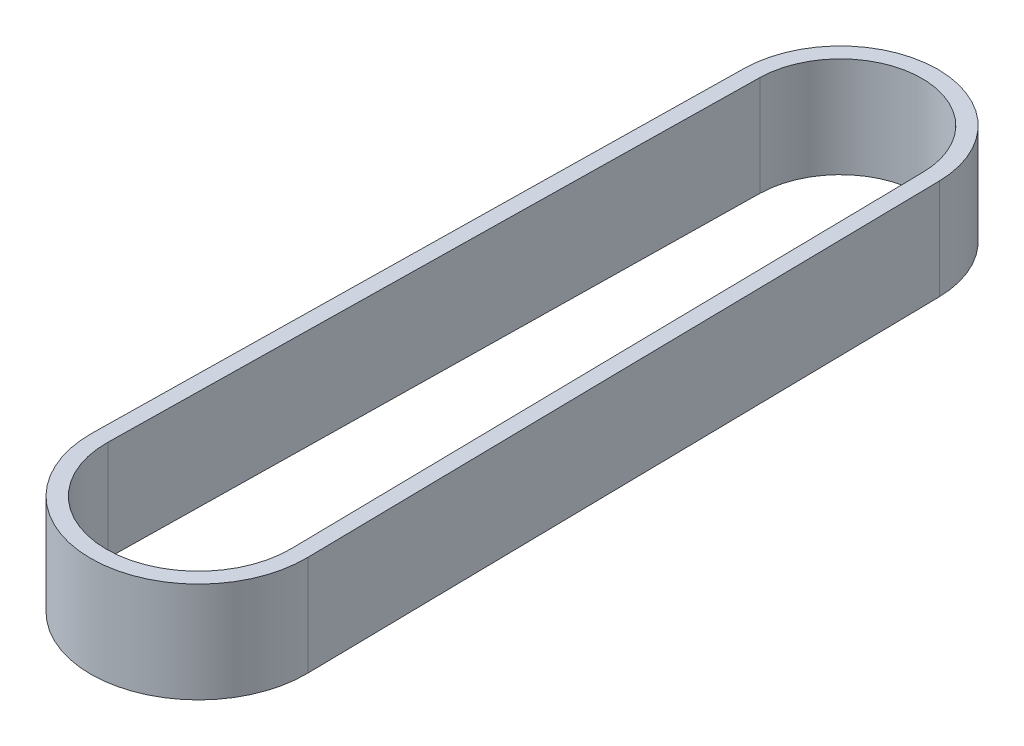
ISO-10303-21;
HEADER;
FILE_DESCRIPTION(('STEP AP214'),'2;1');
FILE_NAME('part.step','',(''),(''),'','','');
FILE_SCHEMA(('AUTOMOTIVE_DESIGN { 1 0 10303 214 1 1 1 1 }'));
ENDSEC;
DATA;
#1=APPLICATION_CONTEXT('core data for automotive mechanical design processes');
#2=APPLICATION_PROTOCOL_DEFINITION('international standard','automotive_design',2000,#1);
#3=PRODUCT_CONTEXT('',#1,'mechanical');
#4=PRODUCT('Part','Part','',(#3));
#5=PRODUCT_RELATED_PRODUCT_CATEGORY('part','',(#4));
#6=PRODUCT_DEFINITION_FORMATION('','',#4);
#7=PRODUCT_DEFINITION_CONTEXT('part definition',#1,'design');
#8=PRODUCT_DEFINITION('design','',#6,#7);
#9=PRODUCT_DEFINITION_SHAPE('','',#8);
#10=(LENGTH_UNIT() NAMED_UNIT(*) SI_UNIT(.MILLI.,.METRE.));
#11=(NAMED_UNIT(*) PLANE_ANGLE_UNIT() SI_UNIT($,.RADIAN.));
#12=(NAMED_UNIT(*) SI_UNIT($,.STERADIAN.) SOLID_ANGLE_UNIT());
#13=UNCERTAINTY_MEASURE_WITH_UNIT(LENGTH_MEASURE(1.E-05),#10,'distance_accuracy_value','');
#14=(GEOMETRIC_REPRESENTATION_CONTEXT(3) GLOBAL_UNCERTAINTY_ASSIGNED_CONTEXT((#13)) GLOBAL_UNIT_ASSIGNED_CONTEXT((#10,
#11,#12)) REPRESENTATION_CONTEXT('',''));
#15=CARTESIAN_POINT('',(0.,0.,0.));
#16=DIRECTION('',(0.,0.,1.));
#17=DIRECTION('',(1.,0.,0.));
#18=AXIS2_PLACEMENT_3D('',#15,#16,#17);
#19=CARTESIAN_POINT('',(1.04950770296597E-13,3.175,12.1000000000001));
#20=DIRECTION('',(0.,1.,0.));
#21=DIRECTION('',(0.,0.,1.));
#22=AXIS2_PLACEMENT_3D('',#19,#20,#21);
#23=PLANE('',#22);
#24=CARTESIAN_POINT('',(1.04950770296597E-13,3.175,12.1000000000001));
#25=DIRECTION('',(0.,1.,0.));
#26=DIRECTION('',(0.,0.,1.));
#27=AXIS2_PLACEMENT_3D('',#24,#25,#26);
#28=CIRCLE('',#27,6.82);
#29=CARTESIAN_POINT('',(-6.8191407924458,3.175,11.9917463497139));
#30=VERTEX_POINT('',#29);
#31=CARTESIAN_POINT('',(6.81914079244601,3.175,11.9917463497139));
#32=VERTEX_POINT('',#31);
#33=EDGE_CURVE('E134',#30,#32,#28,.T.);
#34=ORIENTED_EDGE('',*,*,#33,.T.);
#35=DIRECTION('',(-0.015872969250171,0.,-0.999874016487669));
#36=VECTOR('',#35,1.);
#37=CARTESIAN_POINT('',(6.81914079244601,3.175,11.9917463497139));
#38=LINE('',#37,#36);
#39=CARTESIAN_POINT('',(6.17422205181156,3.175,-28.6331349401801));
#40=VERTEX_POINT('',#39);
#41=EDGE_CURVE('E137',#32,#40,#38,.T.);
#42=ORIENTED_EDGE('',*,*,#41,.T.);
#43=CARTESIAN_POINT('',(2.08166817117217E-13,3.175,-28.5351193550603));
#44=DIRECTION('',(0.,1.,0.));
#45=DIRECTION('',(0.,0.,1.));
#46=AXIS2_PLACEMENT_3D('',#43,#44,#45);
#47=CIRCLE('',#46,6.175);
#48=CARTESIAN_POINT('',(-6.17422205181115,3.175,-28.6331349401801));
#49=VERTEX_POINT('',#48);
#50=EDGE_CURVE('E140',#40,#49,#47,.T.);
#51=ORIENTED_EDGE('',*,*,#50,.T.);
#52=DIRECTION('',(-0.0158729692501762,0.,0.999874016487669));
#53=VECTOR('',#52,1.);
#54=CARTESIAN_POINT('',(-6.17422205181115,3.175,-28.6331349401801));
#55=LINE('',#54,#53);
#56=EDGE_CURVE('E142',#49,#30,#55,.T.);
#57=ORIENTED_EDGE('',*,*,#56,.T.);
#58=EDGE_LOOP('',(#34,#42,#51,#57));
#59=FACE_BOUND('',#58,.T.);
#60=DIRECTION('',(-0.015872969250171,0.,-0.999874016487669));
#61=VECTOR('',#60,1.);
#62=CARTESIAN_POINT('',(5.81926677595834,3.175,12.0076193189641));
#63=LINE('',#62,#61);
#64=CARTESIAN_POINT('',(5.81926677595834,3.175,12.0076193189641));
#65=VERTEX_POINT('',#64);
#66=CARTESIAN_POINT('',(5.17434803532389,3.175,-28.6172619709299));
#67=VERTEX_POINT('',#66);
#68=EDGE_CURVE('E106',#65,#67,#63,.T.);
#69=ORIENTED_EDGE('',*,*,#68,.F.);
#70=CARTESIAN_POINT('',(1.04950770296597E-13,3.175,12.1000000000001));
#71=DIRECTION('',(0.,1.,0.));
#72=DIRECTION('',(0.,0.,1.));
#73=AXIS2_PLACEMENT_3D('',#70,#71,#72);
#74=CIRCLE('',#73,5.82);
#75=CARTESIAN_POINT('',(-5.81926677595814,3.175,12.0076193189641));
#76=VERTEX_POINT('',#75);
#77=EDGE_CURVE('E98',#76,#65,#74,.T.);
#78=ORIENTED_EDGE('',*,*,#77,.F.);
#79=DIRECTION('',(-0.0158729692501761,0.,0.999874016487669));
#80=VECTOR('',#79,1.);
#81=CARTESIAN_POINT('',(-5.17434803532348,3.175,-28.6172619709299));
#82=LINE('',#81,#80);
#83=CARTESIAN_POINT('',(-5.17434803532348,3.175,-28.6172619709299));
#84=VERTEX_POINT('',#83);
#85=EDGE_CURVE('E120',#84,#76,#82,.T.);
#86=ORIENTED_EDGE('',*,*,#85,.F.);
#87=CARTESIAN_POINT('',(2.08166817117217E-13,3.175,-28.5351193550603));
#88=DIRECTION('',(0.,1.,0.));
#89=DIRECTION('',(0.,0.,1.));
#90=AXIS2_PLACEMENT_3D('',#87,#88,#89);
#91=CIRCLE('',#90,5.175);
#92=EDGE_CURVE('E118',#67,#84,#91,.T.);
#93=ORIENTED_EDGE('',*,*,#92,.F.);
#94=EDGE_LOOP('',(#69,#78,#86,#93));
#95=FACE_BOUND('',#94,.T.);
#96=ADVANCED_FACE('F33',(#59,#95),#23,.T.);
#97=CARTESIAN_POINT('',(1.04950770296597E-13,-3.175,12.1000000000001));
#98=DIRECTION('',(0.,1.,0.));
#99=DIRECTION('',(0.,0.,1.));
#100=AXIS2_PLACEMENT_3D('',#97,#98,#99);
#101=PLANE('',#100);
#102=CARTESIAN_POINT('',(1.04950770296597E-13,-3.175,12.1000000000001));
#103=DIRECTION('',(0.,1.,0.));
#104=DIRECTION('',(0.,0.,1.));
#105=AXIS2_PLACEMENT_3D('',#102,#103,#104);
#106=CIRCLE('',#105,6.82);
#107=CARTESIAN_POINT('',(-6.8191407924458,-3.175,11.9917463497139));
#108=VERTEX_POINT('',#107);
#109=CARTESIAN_POINT('',(6.81914079244601,-3.175,11.9917463497139));
#110=VERTEX_POINT('',#109);
#111=EDGE_CURVE('E114',#108,#110,#106,.T.);
#112=ORIENTED_EDGE('',*,*,#111,.F.);
#113=DIRECTION('',(-0.0158729692501762,0.,0.999874016487669));
#114=VECTOR('',#113,1.);
#115=CARTESIAN_POINT('',(-6.17422205181115,-3.175,-28.6331349401801));
#116=LINE('',#115,#114);
#117=CARTESIAN_POINT('',(-6.17422205181115,-3.175,-28.6331349401801));
#118=VERTEX_POINT('',#117);
#119=EDGE_CURVE('E138',#118,#108,#116,.T.);
#120=ORIENTED_EDGE('',*,*,#119,.F.);
#121=CARTESIAN_POINT('',(2.08166817117217E-13,-3.175,-28.5351193550603));
#122=DIRECTION('',(0.,1.,0.));
#123=DIRECTION('',(0.,0.,1.));
#124=AXIS2_PLACEMENT_3D('',#121,#122,#123);
#125=CIRCLE('',#124,6.175);
#126=CARTESIAN_POINT('',(6.17422205181156,-3.175,-28.6331349401801));
#127=VERTEX_POINT('',#126);
#128=EDGE_CURVE('E149',#127,#118,#125,.T.);
#129=ORIENTED_EDGE('',*,*,#128,.F.);
#130=DIRECTION('',(-0.015872969250171,0.,-0.999874016487669));
#131=VECTOR('',#130,1.);
#132=CARTESIAN_POINT('',(6.81914079244601,-3.175,11.9917463497139));
#133=LINE('',#132,#131);
#134=EDGE_CURVE('E147',#110,#127,#133,.T.);
#135=ORIENTED_EDGE('',*,*,#134,.F.);
#136=EDGE_LOOP('',(#112,#120,#129,#135));
#137=FACE_BOUND('',#136,.T.);
#138=CARTESIAN_POINT('',(1.04950770296597E-13,-3.175,12.1000000000001));
#139=DIRECTION('',(0.,1.,0.));
#140=DIRECTION('',(0.,0.,1.));
#141=AXIS2_PLACEMENT_3D('',#138,#139,#140);
#142=CIRCLE('',#141,5.82);
#143=CARTESIAN_POINT('',(-5.81926677595814,-3.175,12.0076193189641));
#144=VERTEX_POINT('',#143);
#145=CARTESIAN_POINT('',(5.81926677595834,-3.175,12.0076193189641));
#146=VERTEX_POINT('',#145);
#147=EDGE_CURVE('E56',#144,#146,#142,.T.);
#148=ORIENTED_EDGE('',*,*,#147,.T.);
#149=DIRECTION('',(-0.015872969250171,0.,-0.999874016487669));
#150=VECTOR('',#149,1.);
#151=CARTESIAN_POINT('',(5.81926677595834,-3.175,12.0076193189641));
#152=LINE('',#151,#150);
#153=CARTESIAN_POINT('',(5.17434803532389,-3.175,-28.6172619709299));
#154=VERTEX_POINT('',#153);
#155=EDGE_CURVE('E113',#146,#154,#152,.T.);
#156=ORIENTED_EDGE('',*,*,#155,.T.);
#157=CARTESIAN_POINT('',(2.08166817117217E-13,-3.175,-28.5351193550603));
#158=DIRECTION('',(0.,1.,0.));
#159=DIRECTION('',(0.,0.,1.));
#160=AXIS2_PLACEMENT_3D('',#157,#158,#159);
#161=CIRCLE('',#160,5.175);
#162=CARTESIAN_POINT('',(-5.17434803532348,-3.175,-28.6172619709299));
#163=VERTEX_POINT('',#162);
#164=EDGE_CURVE('E126',#154,#163,#161,.T.);
#165=ORIENTED_EDGE('',*,*,#164,.T.);
#166=DIRECTION('',(-0.0158729692501761,0.,0.999874016487669));
#167=VECTOR('',#166,1.);
#168=CARTESIAN_POINT('',(-5.17434803532348,-3.175,-28.6172619709299));
#169=LINE('',#168,#167);
#170=EDGE_CURVE('E107',#163,#144,#169,.T.);
#171=ORIENTED_EDGE('',*,*,#170,.T.);
#172=EDGE_LOOP('',(#148,#156,#165,#171));
#173=FACE_BOUND('',#172,.T.);
#174=ADVANCED_FACE('F167',(#137,#173),#101,.F.);
#175=CARTESIAN_POINT('',(1.04950770296597E-13,3.175,12.1000000000001));
#176=DIRECTION('',(0.,-1.,0.));
#177=DIRECTION('',(0.,0.,-1.));
#178=AXIS2_PLACEMENT_3D('',#175,#176,#177);
#179=CYLINDRICAL_SURFACE('',#178,6.82);
#180=ORIENTED_EDGE('',*,*,#111,.T.);
#181=DIRECTION('',(0.,-1.,0.));
#182=VECTOR('',#181,1.);
#183=CARTESIAN_POINT('',(6.81914079244601,3.175,11.9917463497139));
#184=LINE('',#183,#182);
#185=EDGE_CURVE('E11',#32,#110,#184,.T.);
#186=ORIENTED_EDGE('',*,*,#185,.F.);
#187=ORIENTED_EDGE('',*,*,#33,.F.);
#188=DIRECTION('',(0.,-1.,0.));
#189=VECTOR('',#188,1.);
#190=CARTESIAN_POINT('',(-6.8191407924458,3.175,11.9917463497139));
#191=LINE('',#190,#189);
#192=EDGE_CURVE('E144',#30,#108,#191,.T.);
#193=ORIENTED_EDGE('',*,*,#192,.T.);
#194=EDGE_LOOP('',(#180,#186,#187,#193));
#195=FACE_BOUND('',#194,.T.);
#196=ADVANCED_FACE('F35',(#195),#179,.T.);
#197=CARTESIAN_POINT('',(6.81914079244601,3.175,11.9917463497139));
#198=DIRECTION('',(-0.999874016487669,0.,0.015872969250171));
#199=DIRECTION('',(0.015872969250171,0.,0.999874016487669));
#200=AXIS2_PLACEMENT_3D('',#197,#198,#199);
#201=PLANE('',#200);
#202=ORIENTED_EDGE('',*,*,#134,.T.);
#203=DIRECTION('',(0.,-1.,0.));
#204=VECTOR('',#203,1.);
#205=CARTESIAN_POINT('',(6.17422205181156,3.175,-28.6331349401801));
#206=LINE('',#205,#204);
#207=EDGE_CURVE('E41',#40,#127,#206,.T.);
#208=ORIENTED_EDGE('',*,*,#207,.F.);
#209=ORIENTED_EDGE('',*,*,#41,.F.);
#210=ORIENTED_EDGE('',*,*,#185,.T.);
#211=EDGE_LOOP('',(#202,#208,#209,#210));
#212=FACE_BOUND('',#211,.T.);
#213=ADVANCED_FACE('F177',(#212),#201,.F.);
#214=CARTESIAN_POINT('',(2.08166817117217E-13,3.175,-28.5351193550603));
#215=DIRECTION('',(0.,-1.,0.));
#216=DIRECTION('',(0.,0.,-1.));
#217=AXIS2_PLACEMENT_3D('',#214,#215,#216);
#218=CYLINDRICAL_SURFACE('',#217,6.175);
#219=ORIENTED_EDGE('',*,*,#128,.T.);
#220=DIRECTION('',(0.,-1.,0.));
#221=VECTOR('',#220,1.);
#222=CARTESIAN_POINT('',(-6.17422205181115,3.175,-28.6331349401801));
#223=LINE('',#222,#221);
#224=EDGE_CURVE('E154',#49,#118,#223,.T.);
#225=ORIENTED_EDGE('',*,*,#224,.F.);
#226=ORIENTED_EDGE('',*,*,#50,.F.);
#227=ORIENTED_EDGE('',*,*,#207,.T.);
#228=EDGE_LOOP('',(#219,#225,#226,#227));
#229=FACE_BOUND('',#228,.T.);
#230=ADVANCED_FACE('F161',(#229),#218,.T.);
#231=CARTESIAN_POINT('',(-6.17422205181115,3.175,-28.6331349401801));
#232=DIRECTION('',(0.999874016487669,0.,0.0158729692501762));
#233=DIRECTION('',(0.0158729692501762,0.,-0.999874016487669));
#234=AXIS2_PLACEMENT_3D('',#231,#232,#233);
#235=PLANE('',#234);
#236=ORIENTED_EDGE('',*,*,#119,.T.);
#237=ORIENTED_EDGE('',*,*,#192,.F.);
#238=ORIENTED_EDGE('',*,*,#56,.F.);
#239=ORIENTED_EDGE('',*,*,#224,.T.);
#240=EDGE_LOOP('',(#236,#237,#238,#239));
#241=FACE_BOUND('',#240,.T.);
#242=ADVANCED_FACE('F171',(#241),#235,.F.);
#243=CARTESIAN_POINT('',(1.04950770296597E-13,3.175,12.1000000000001));
#244=DIRECTION('',(0.,-1.,0.));
#245=DIRECTION('',(0.,0.,-1.));
#246=AXIS2_PLACEMENT_3D('',#243,#244,#245);
#247=CYLINDRICAL_SURFACE('',#246,5.82);
#248=ORIENTED_EDGE('',*,*,#147,.F.);
#249=DIRECTION('',(0.,-1.,0.));
#250=VECTOR('',#249,1.);
#251=CARTESIAN_POINT('',(-5.81926677595814,3.175,12.0076193189641));
#252=LINE('',#251,#250);
#253=EDGE_CURVE('E102',#76,#144,#252,.T.);
#254=ORIENTED_EDGE('',*,*,#253,.F.);
#255=ORIENTED_EDGE('',*,*,#77,.T.);
#256=DIRECTION('',(0.,-1.,0.));
#257=VECTOR('',#256,1.);
#258=CARTESIAN_POINT('',(5.81926677595834,3.175,12.0076193189641));
#259=LINE('',#258,#257);
#260=EDGE_CURVE('E101',#65,#146,#259,.T.);
#261=ORIENTED_EDGE('',*,*,#260,.T.);
#262=EDGE_LOOP('',(#248,#254,#255,#261));
#263=FACE_BOUND('',#262,.T.);
#264=ADVANCED_FACE('F100',(#263),#247,.F.);
#265=CARTESIAN_POINT('',(5.81926677595834,3.175,12.0076193189641));
#266=DIRECTION('',(-0.999874016487669,0.,0.015872969250171));
#267=DIRECTION('',(0.015872969250171,0.,0.999874016487669));
#268=AXIS2_PLACEMENT_3D('',#265,#266,#267);
#269=PLANE('',#268);
#270=ORIENTED_EDGE('',*,*,#155,.F.);
#271=ORIENTED_EDGE('',*,*,#260,.F.);
#272=ORIENTED_EDGE('',*,*,#68,.T.);
#273=DIRECTION('',(0.,-1.,0.));
#274=VECTOR('',#273,1.);
#275=CARTESIAN_POINT('',(5.17434803532389,3.175,-28.6172619709299));
#276=LINE('',#275,#274);
#277=EDGE_CURVE('E115',#67,#154,#276,.T.);
#278=ORIENTED_EDGE('',*,*,#277,.T.);
#279=EDGE_LOOP('',(#270,#271,#272,#278));
#280=FACE_BOUND('',#279,.T.);
#281=ADVANCED_FACE('F110',(#280),#269,.T.);
#282=CARTESIAN_POINT('',(2.08166817117217E-13,3.175,-28.5351193550603));
#283=DIRECTION('',(0.,-1.,0.));
#284=DIRECTION('',(0.,0.,-1.));
#285=AXIS2_PLACEMENT_3D('',#282,#283,#284);
#286=CYLINDRICAL_SURFACE('',#285,5.175);
#287=ORIENTED_EDGE('',*,*,#164,.F.);
#288=ORIENTED_EDGE('',*,*,#277,.F.);
#289=ORIENTED_EDGE('',*,*,#92,.T.);
#290=DIRECTION('',(0.,-1.,0.));
#291=VECTOR('',#290,1.);
#292=CARTESIAN_POINT('',(-5.17434803532348,3.175,-28.6172619709299));
#293=LINE('',#292,#291);
#294=EDGE_CURVE('E48',#84,#163,#293,.T.);
#295=ORIENTED_EDGE('',*,*,#294,.T.);
#296=EDGE_LOOP('',(#287,#288,#289,#295));
#297=FACE_BOUND('',#296,.T.);
#298=ADVANCED_FACE('F200',(#297),#286,.F.);
#299=CARTESIAN_POINT('',(-5.17434803532348,3.175,-28.6172619709299));
#300=DIRECTION('',(0.999874016487669,0.,0.0158729692501761));
#301=DIRECTION('',(0.0158729692501761,0.,-0.999874016487669));
#302=AXIS2_PLACEMENT_3D('',#299,#300,#301);
#303=PLANE('',#302);
#304=ORIENTED_EDGE('',*,*,#170,.F.);
#305=ORIENTED_EDGE('',*,*,#294,.F.);
#306=ORIENTED_EDGE('',*,*,#85,.T.);
#307=ORIENTED_EDGE('',*,*,#253,.T.);
#308=EDGE_LOOP('',(#304,#305,#306,#307));
#309=FACE_BOUND('',#308,.T.);
#310=ADVANCED_FACE('F204',(#309),#303,.T.);
#311=CLOSED_SHELL('',(#96,#174,#196,#213,#230,#242,#264,#281,#298,#310));
#312=MANIFOLD_SOLID_BREP('B2',#311);
#313=ADVANCED_BREP_SHAPE_REPRESENTATION('',(#18,#312),#14);
#314=SHAPE_DEFINITION_REPRESENTATION(#9,#313);
ENDSEC;
END-ISO-10303-21;
